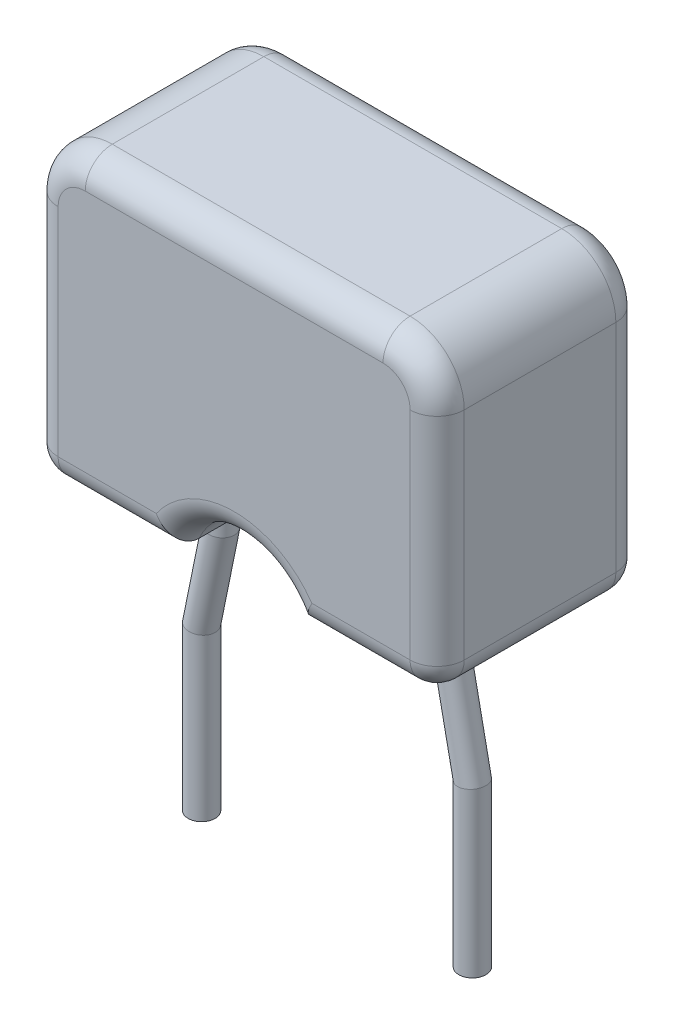
ISO-10303-21;
HEADER;
FILE_DESCRIPTION(('STEP AP214'),'2;1');
FILE_NAME('part.step','',(''),(''),'','','');
FILE_SCHEMA(('AUTOMOTIVE_DESIGN { 1 0 10303 214 1 1 1 1 }'));
ENDSEC;
DATA;
#1=APPLICATION_CONTEXT('core data for automotive mechanical design processes');
#2=APPLICATION_PROTOCOL_DEFINITION('international standard','automotive_design',2000,#1);
#3=PRODUCT_CONTEXT('',#1,'mechanical');
#4=PRODUCT('Part','Part','',(#3));
#5=PRODUCT_RELATED_PRODUCT_CATEGORY('part','',(#4));
#6=PRODUCT_DEFINITION_FORMATION('','',#4);
#7=PRODUCT_DEFINITION_CONTEXT('part definition',#1,'design');
#8=PRODUCT_DEFINITION('design','',#6,#7);
#9=PRODUCT_DEFINITION_SHAPE('','',#8);
#10=(LENGTH_UNIT() NAMED_UNIT(*) SI_UNIT(.MILLI.,.METRE.));
#11=(NAMED_UNIT(*) PLANE_ANGLE_UNIT() SI_UNIT($,.RADIAN.));
#12=(NAMED_UNIT(*) SI_UNIT($,.STERADIAN.) SOLID_ANGLE_UNIT());
#13=UNCERTAINTY_MEASURE_WITH_UNIT(LENGTH_MEASURE(1.E-05),#10,'distance_accuracy_value','');
#14=(GEOMETRIC_REPRESENTATION_CONTEXT(3) GLOBAL_UNCERTAINTY_ASSIGNED_CONTEXT((#13)) GLOBAL_UNIT_ASSIGNED_CONTEXT((#10,
#11,#12)) REPRESENTATION_CONTEXT('',''));
#15=CARTESIAN_POINT('',(0.,0.,0.));
#16=DIRECTION('',(0.,0.,1.));
#17=DIRECTION('',(1.,0.,0.));
#18=AXIS2_PLACEMENT_3D('',#15,#16,#17);
#19=CARTESIAN_POINT('',(-3.75,-2.75,3.8));
#20=DIRECTION('',(0.,1.,0.));
#21=DIRECTION('',(0.,0.,1.));
#22=AXIS2_PLACEMENT_3D('',#19,#20,#21);
#23=PLANE('',#22);
#24=CARTESIAN_POINT('',(-2.14564392373896,-2.75,1.9));
#25=DIRECTION('',(0.,1.,0.));
#26=DIRECTION('',(0.,0.,1.));
#27=AXIS2_PLACEMENT_3D('',#24,#25,#26);
#28=CIRCLE('',#27,0.25);
#29=CARTESIAN_POINT('',(-2.14564392373896,-2.75,2.15));
#30=VERTEX_POINT('',#29);
#31=EDGE_CURVE('E71',#30,#30,#28,.F.);
#32=ORIENTED_EDGE('',*,*,#31,.F.);
#33=EDGE_LOOP('',(#32));
#34=FACE_BOUND('',#33,.T.);
#35=DIRECTION('',(0.,0.,-1.));
#36=VECTOR('',#35,1.);
#37=CARTESIAN_POINT('',(-3.25,-2.75,3.8));
#38=LINE('',#37,#36);
#39=CARTESIAN_POINT('',(-3.25,-2.75,3.3));
#40=VERTEX_POINT('',#39);
#41=CARTESIAN_POINT('',(-3.25,-2.75,0.5));
#42=VERTEX_POINT('',#41);
#43=EDGE_CURVE('E442',#40,#42,#38,.T.);
#44=ORIENTED_EDGE('',*,*,#43,.T.);
#45=DIRECTION('',(1.,0.,0.));
#46=VECTOR('',#45,1.);
#47=CARTESIAN_POINT('',(-1.14564392373896,-2.75,0.5));
#48=LINE('',#47,#46);
#49=CARTESIAN_POINT('',(-1.14564392373896,-2.75,0.5));
#50=VERTEX_POINT('',#49);
#51=EDGE_CURVE('E241',#42,#50,#48,.T.);
#52=ORIENTED_EDGE('',*,*,#51,.T.);
#53=DIRECTION('',(0.,0.,1.));
#54=VECTOR('',#53,1.);
#55=CARTESIAN_POINT('',(-1.14564392373896,-2.75,0.));
#56=LINE('',#55,#54);
#57=CARTESIAN_POINT('',(-1.14564392373896,-2.75,3.3));
#58=VERTEX_POINT('',#57);
#59=EDGE_CURVE('E420',#50,#58,#56,.T.);
#60=ORIENTED_EDGE('',*,*,#59,.T.);
#61=DIRECTION('',(1.,0.,0.));
#62=VECTOR('',#61,1.);
#63=CARTESIAN_POINT('',(-3.75,-2.75,3.3));
#64=LINE('',#63,#62);
#65=EDGE_CURVE('E239',#58,#40,#64,.F.);
#66=ORIENTED_EDGE('',*,*,#65,.T.);
#67=EDGE_LOOP('',(#44,#52,#60,#66));
#68=FACE_BOUND('',#67,.T.);
#69=ADVANCED_FACE('F63',(#34,#68),#23,.F.);
#70=CARTESIAN_POINT('',(3.75,-2.75,3.8));
#71=DIRECTION('',(-1.,0.,0.));
#72=DIRECTION('',(0.,0.,1.));
#73=AXIS2_PLACEMENT_3D('',#70,#71,#72);
#74=PLANE('',#73);
#75=DIRECTION('',(0.,0.,-1.));
#76=VECTOR('',#75,1.);
#77=CARTESIAN_POINT('',(3.75,-2.25,3.8));
#78=LINE('',#77,#76);
#79=CARTESIAN_POINT('',(3.75,-2.25,3.3));
#80=VERTEX_POINT('',#79);
#81=CARTESIAN_POINT('',(3.75,-2.25,0.5));
#82=VERTEX_POINT('',#81);
#83=EDGE_CURVE('E434',#80,#82,#78,.T.);
#84=ORIENTED_EDGE('',*,*,#83,.T.);
#85=DIRECTION('',(0.,1.,0.));
#86=VECTOR('',#85,1.);
#87=CARTESIAN_POINT('',(3.75,1.75,0.5));
#88=LINE('',#87,#86);
#89=CARTESIAN_POINT('',(3.75,1.75,0.5));
#90=VERTEX_POINT('',#89);
#91=EDGE_CURVE('E258',#82,#90,#88,.T.);
#92=ORIENTED_EDGE('',*,*,#91,.T.);
#93=DIRECTION('',(0.,0.,-1.));
#94=VECTOR('',#93,1.);
#95=CARTESIAN_POINT('',(3.75,1.75,3.8));
#96=LINE('',#95,#94);
#97=CARTESIAN_POINT('',(3.75,1.75,3.3));
#98=VERTEX_POINT('',#97);
#99=EDGE_CURVE('E445',#90,#98,#96,.F.);
#100=ORIENTED_EDGE('',*,*,#99,.T.);
#101=DIRECTION('',(0.,1.,0.));
#102=VECTOR('',#101,1.);
#103=CARTESIAN_POINT('',(3.75,-2.75,3.3));
#104=LINE('',#103,#102);
#105=EDGE_CURVE('E256',#98,#80,#104,.F.);
#106=ORIENTED_EDGE('',*,*,#105,.T.);
#107=EDGE_LOOP('',(#84,#92,#100,#106));
#108=FACE_BOUND('',#107,.T.);
#109=ADVANCED_FACE('F384',(#108),#74,.F.);
#110=CARTESIAN_POINT('',(-3.75,2.75,3.8));
#111=DIRECTION('',(0.,-1.,0.));
#112=DIRECTION('',(0.,0.,-1.));
#113=AXIS2_PLACEMENT_3D('',#110,#111,#112);
#114=PLANE('',#113);
#115=DIRECTION('',(0.,0.,-1.));
#116=VECTOR('',#115,1.);
#117=CARTESIAN_POINT('',(2.75,2.75,3.8));
#118=LINE('',#117,#116);
#119=CARTESIAN_POINT('',(2.75,2.75,3.3));
#120=VERTEX_POINT('',#119);
#121=CARTESIAN_POINT('',(2.75,2.75,0.5));
#122=VERTEX_POINT('',#121);
#123=EDGE_CURVE('E475',#120,#122,#118,.T.);
#124=ORIENTED_EDGE('',*,*,#123,.T.);
#125=DIRECTION('',(-1.,0.,0.));
#126=VECTOR('',#125,1.);
#127=CARTESIAN_POINT('',(-2.75,2.75,0.5));
#128=LINE('',#127,#126);
#129=CARTESIAN_POINT('',(-2.75,2.75,0.5));
#130=VERTEX_POINT('',#129);
#131=EDGE_CURVE('E225',#122,#130,#128,.T.);
#132=ORIENTED_EDGE('',*,*,#131,.T.);
#133=DIRECTION('',(0.,0.,-1.));
#134=VECTOR('',#133,1.);
#135=CARTESIAN_POINT('',(-2.75,2.75,3.8));
#136=LINE('',#135,#134);
#137=CARTESIAN_POINT('',(-2.75,2.75,3.3));
#138=VERTEX_POINT('',#137);
#139=EDGE_CURVE('E478',#130,#138,#136,.F.);
#140=ORIENTED_EDGE('',*,*,#139,.T.);
#141=DIRECTION('',(-1.,0.,0.));
#142=VECTOR('',#141,1.);
#143=CARTESIAN_POINT('',(-3.75,2.75,3.3));
#144=LINE('',#143,#142);
#145=EDGE_CURVE('E223',#138,#120,#144,.F.);
#146=ORIENTED_EDGE('',*,*,#145,.T.);
#147=EDGE_LOOP('',(#124,#132,#140,#146));
#148=FACE_BOUND('',#147,.T.);
#149=ADVANCED_FACE('F391',(#148),#114,.F.);
#150=CARTESIAN_POINT('',(-3.75,-2.75,3.8));
#151=DIRECTION('',(1.,0.,0.));
#152=DIRECTION('',(0.,0.,-1.));
#153=AXIS2_PLACEMENT_3D('',#150,#151,#152);
#154=PLANE('',#153);
#155=DIRECTION('',(0.,0.,-1.));
#156=VECTOR('',#155,1.);
#157=CARTESIAN_POINT('',(-3.75,1.75,3.8));
#158=LINE('',#157,#156);
#159=CARTESIAN_POINT('',(-3.75,1.75,3.3));
#160=VERTEX_POINT('',#159);
#161=CARTESIAN_POINT('',(-3.75,1.75,0.5));
#162=VERTEX_POINT('',#161);
#163=EDGE_CURVE('E440',#160,#162,#158,.T.);
#164=ORIENTED_EDGE('',*,*,#163,.T.);
#165=DIRECTION('',(0.,-1.,0.));
#166=VECTOR('',#165,1.);
#167=CARTESIAN_POINT('',(-3.75,-2.25,0.5));
#168=LINE('',#167,#166);
#169=CARTESIAN_POINT('',(-3.75,-2.25,0.5));
#170=VERTEX_POINT('',#169);
#171=EDGE_CURVE('E233',#162,#170,#168,.T.);
#172=ORIENTED_EDGE('',*,*,#171,.T.);
#173=DIRECTION('',(0.,0.,-1.));
#174=VECTOR('',#173,1.);
#175=CARTESIAN_POINT('',(-3.75,-2.25,3.8));
#176=LINE('',#175,#174);
#177=CARTESIAN_POINT('',(-3.75,-2.25,3.3));
#178=VERTEX_POINT('',#177);
#179=EDGE_CURVE('E209',#170,#178,#176,.F.);
#180=ORIENTED_EDGE('',*,*,#179,.T.);
#181=DIRECTION('',(0.,-1.,0.));
#182=VECTOR('',#181,1.);
#183=CARTESIAN_POINT('',(-3.75,-2.75,3.3));
#184=LINE('',#183,#182);
#185=EDGE_CURVE('E231',#178,#160,#184,.F.);
#186=ORIENTED_EDGE('',*,*,#185,.T.);
#187=EDGE_LOOP('',(#164,#172,#180,#186));
#188=FACE_BOUND('',#187,.T.);
#189=ADVANCED_FACE('F400',(#188),#154,.F.);
#190=CARTESIAN_POINT('',(2.14564392373896,-2.75,1.9));
#191=DIRECTION('',(0.,1.,0.));
#192=DIRECTION('',(0.,0.,1.));
#193=AXIS2_PLACEMENT_3D('',#190,#191,#192);
#194=CIRCLE('',#193,0.25);
#195=CARTESIAN_POINT('',(2.14564392373896,-2.75,2.15));
#196=VERTEX_POINT('',#195);
#197=EDGE_CURVE('E12',#196,#196,#194,.F.);
#198=ORIENTED_EDGE('',*,*,#197,.F.);
#199=EDGE_LOOP('',(#198));
#200=FACE_BOUND('',#199,.T.);
#201=DIRECTION('',(0.,0.,1.));
#202=VECTOR('',#201,1.);
#203=CARTESIAN_POINT('',(1.14564392373896,-2.75,0.));
#204=LINE('',#203,#202);
#205=CARTESIAN_POINT('',(1.14564392373896,-2.75,3.3));
#206=VERTEX_POINT('',#205);
#207=CARTESIAN_POINT('',(1.14564392373896,-2.75,0.5));
#208=VERTEX_POINT('',#207);
#209=EDGE_CURVE('E412',#206,#208,#204,.F.);
#210=ORIENTED_EDGE('',*,*,#209,.T.);
#211=DIRECTION('',(1.,0.,0.));
#212=VECTOR('',#211,1.);
#213=CARTESIAN_POINT('',(3.25,-2.75,0.5));
#214=LINE('',#213,#212);
#215=CARTESIAN_POINT('',(3.25,-2.75,0.5));
#216=VERTEX_POINT('',#215);
#217=EDGE_CURVE('E250',#208,#216,#214,.T.);
#218=ORIENTED_EDGE('',*,*,#217,.T.);
#219=DIRECTION('',(0.,0.,-1.));
#220=VECTOR('',#219,1.);
#221=CARTESIAN_POINT('',(3.25,-2.75,3.8));
#222=LINE('',#221,#220);
#223=CARTESIAN_POINT('',(3.25,-2.75,3.3));
#224=VERTEX_POINT('',#223);
#225=EDGE_CURVE('E436',#216,#224,#222,.F.);
#226=ORIENTED_EDGE('',*,*,#225,.T.);
#227=DIRECTION('',(1.,0.,0.));
#228=VECTOR('',#227,1.);
#229=CARTESIAN_POINT('',(-3.75,-2.75,3.3));
#230=LINE('',#229,#228);
#231=EDGE_CURVE('E248',#224,#206,#230,.F.);
#232=ORIENTED_EDGE('',*,*,#231,.T.);
#233=EDGE_LOOP('',(#210,#218,#226,#232));
#234=FACE_BOUND('',#233,.T.);
#235=ADVANCED_FACE('F387',(#200,#234),#23,.F.);
#236=CARTESIAN_POINT('',(0.,0.,3.8));
#237=DIRECTION('',(0.,0.,-1.));
#238=DIRECTION('',(-1.,0.,0.));
#239=AXIS2_PLACEMENT_3D('',#236,#237,#238);
#240=PLANE('',#239);
#241=DIRECTION('',(1.,0.,0.));
#242=VECTOR('',#241,1.);
#243=CARTESIAN_POINT('',(0.,-2.25,3.8));
#244=LINE('',#243,#242);
#245=CARTESIAN_POINT('',(-3.25,-2.25,3.8));
#246=VERTEX_POINT('',#245);
#247=CARTESIAN_POINT('',(-1.43614066163451,-2.25,3.8));
#248=VERTEX_POINT('',#247);
#249=EDGE_CURVE('E78',#246,#248,#244,.T.);
#250=ORIENTED_EDGE('',*,*,#249,.T.);
#251=CARTESIAN_POINT('',(0.,-3.25,3.8));
#252=DIRECTION('',(0.,0.,-1.));
#253=DIRECTION('',(-1.,0.,0.));
#254=AXIS2_PLACEMENT_3D('',#251,#252,#253);
#255=CIRCLE('',#254,1.75);
#256=CARTESIAN_POINT('',(1.43614066163451,-2.25,3.8));
#257=VERTEX_POINT('',#256);
#258=EDGE_CURVE('E272',#248,#257,#255,.T.);
#259=ORIENTED_EDGE('',*,*,#258,.T.);
#260=DIRECTION('',(1.,0.,0.));
#261=VECTOR('',#260,1.);
#262=CARTESIAN_POINT('',(0.,-2.25,3.8));
#263=LINE('',#262,#261);
#264=CARTESIAN_POINT('',(3.25,-2.25,3.8));
#265=VERTEX_POINT('',#264);
#266=EDGE_CURVE('E260',#257,#265,#263,.T.);
#267=ORIENTED_EDGE('',*,*,#266,.T.);
#268=DIRECTION('',(0.,1.,0.));
#269=VECTOR('',#268,1.);
#270=CARTESIAN_POINT('',(3.25,0.,3.8));
#271=LINE('',#270,#269);
#272=CARTESIAN_POINT('',(3.25,1.75,3.8));
#273=VERTEX_POINT('',#272);
#274=EDGE_CURVE('E262',#265,#273,#271,.T.);
#275=ORIENTED_EDGE('',*,*,#274,.T.);
#276=CARTESIAN_POINT('',(2.75,1.75,3.8));
#277=DIRECTION('',(0.,0.,-1.));
#278=DIRECTION('',(-1.,0.,0.));
#279=AXIS2_PLACEMENT_3D('',#276,#277,#278);
#280=CIRCLE('',#279,0.5);
#281=CARTESIAN_POINT('',(2.75,2.25,3.8));
#282=VERTEX_POINT('',#281);
#283=EDGE_CURVE('E264',#273,#282,#280,.F.);
#284=ORIENTED_EDGE('',*,*,#283,.T.);
#285=DIRECTION('',(-1.,0.,0.));
#286=VECTOR('',#285,1.);
#287=CARTESIAN_POINT('',(0.,2.25,3.8));
#288=LINE('',#287,#286);
#289=CARTESIAN_POINT('',(-2.75,2.25,3.8));
#290=VERTEX_POINT('',#289);
#291=EDGE_CURVE('E266',#282,#290,#288,.T.);
#292=ORIENTED_EDGE('',*,*,#291,.T.);
#293=CARTESIAN_POINT('',(-2.75,1.75,3.8));
#294=DIRECTION('',(0.,0.,-1.));
#295=DIRECTION('',(-1.,0.,0.));
#296=AXIS2_PLACEMENT_3D('',#293,#294,#295);
#297=CIRCLE('',#296,0.5);
#298=CARTESIAN_POINT('',(-3.25,1.75,3.8));
#299=VERTEX_POINT('',#298);
#300=EDGE_CURVE('E268',#290,#299,#297,.F.);
#301=ORIENTED_EDGE('',*,*,#300,.T.);
#302=DIRECTION('',(0.,-1.,0.));
#303=VECTOR('',#302,1.);
#304=CARTESIAN_POINT('',(-3.25,0.,3.8));
#305=LINE('',#304,#303);
#306=EDGE_CURVE('E83',#299,#246,#305,.T.);
#307=ORIENTED_EDGE('',*,*,#306,.T.);
#308=EDGE_LOOP('',(#250,#259,#267,#275,#284,#292,#301,#307));
#309=FACE_BOUND('',#308,.T.);
#310=ADVANCED_FACE('F399',(#309),#240,.F.);
#311=CARTESIAN_POINT('',(0.,0.,0.));
#312=DIRECTION('',(0.,0.,-1.));
#313=DIRECTION('',(-1.,0.,0.));
#314=AXIS2_PLACEMENT_3D('',#311,#312,#313);
#315=PLANE('',#314);
#316=DIRECTION('',(-1.,0.,0.));
#317=VECTOR('',#316,1.);
#318=CARTESIAN_POINT('',(2.75,2.25,0.));
#319=LINE('',#318,#317);
#320=CARTESIAN_POINT('',(-2.75,2.25,0.));
#321=VERTEX_POINT('',#320);
#322=CARTESIAN_POINT('',(2.75,2.25,0.));
#323=VERTEX_POINT('',#322);
#324=EDGE_CURVE('E213',#321,#323,#319,.F.);
#325=ORIENTED_EDGE('',*,*,#324,.T.);
#326=CARTESIAN_POINT('',(2.75,1.75,0.));
#327=DIRECTION('',(0.,0.,-1.));
#328=DIRECTION('',(-1.,0.,0.));
#329=AXIS2_PLACEMENT_3D('',#326,#327,#328);
#330=CIRCLE('',#329,0.5);
#331=CARTESIAN_POINT('',(3.25,1.75,0.));
#332=VERTEX_POINT('',#331);
#333=EDGE_CURVE('E193',#323,#332,#330,.T.);
#334=ORIENTED_EDGE('',*,*,#333,.T.);
#335=DIRECTION('',(0.,1.,0.));
#336=VECTOR('',#335,1.);
#337=CARTESIAN_POINT('',(3.25,-2.25,0.));
#338=LINE('',#337,#336);
#339=CARTESIAN_POINT('',(3.25,-2.25,0.));
#340=VERTEX_POINT('',#339);
#341=EDGE_CURVE('E202',#332,#340,#338,.F.);
#342=ORIENTED_EDGE('',*,*,#341,.T.);
#343=DIRECTION('',(1.,0.,0.));
#344=VECTOR('',#343,1.);
#345=CARTESIAN_POINT('',(1.14564392373896,-2.25,0.));
#346=LINE('',#345,#344);
#347=CARTESIAN_POINT('',(1.43614066163451,-2.25,0.));
#348=VERTEX_POINT('',#347);
#349=EDGE_CURVE('E208',#340,#348,#346,.F.);
#350=ORIENTED_EDGE('',*,*,#349,.T.);
#351=CARTESIAN_POINT('',(0.,-3.25,0.));
#352=DIRECTION('',(0.,0.,-1.));
#353=DIRECTION('',(-1.,0.,0.));
#354=AXIS2_PLACEMENT_3D('',#351,#352,#353);
#355=CIRCLE('',#354,1.75);
#356=CARTESIAN_POINT('',(-1.43614066163451,-2.25,0.));
#357=VERTEX_POINT('',#356);
#358=EDGE_CURVE('E424',#348,#357,#355,.F.);
#359=ORIENTED_EDGE('',*,*,#358,.T.);
#360=DIRECTION('',(1.,0.,0.));
#361=VECTOR('',#360,1.);
#362=CARTESIAN_POINT('',(-3.25,-2.25,0.));
#363=LINE('',#362,#361);
#364=CARTESIAN_POINT('',(-3.25,-2.25,0.));
#365=VERTEX_POINT('',#364);
#366=EDGE_CURVE('E455',#357,#365,#363,.F.);
#367=ORIENTED_EDGE('',*,*,#366,.T.);
#368=DIRECTION('',(0.,-1.,0.));
#369=VECTOR('',#368,1.);
#370=CARTESIAN_POINT('',(-3.25,1.75,0.));
#371=LINE('',#370,#369);
#372=CARTESIAN_POINT('',(-3.25,1.75,0.));
#373=VERTEX_POINT('',#372);
#374=EDGE_CURVE('E457',#365,#373,#371,.F.);
#375=ORIENTED_EDGE('',*,*,#374,.T.);
#376=CARTESIAN_POINT('',(-2.75,1.75,0.));
#377=DIRECTION('',(0.,0.,-1.));
#378=DIRECTION('',(-1.,0.,0.));
#379=AXIS2_PLACEMENT_3D('',#376,#377,#378);
#380=CIRCLE('',#379,0.5);
#381=EDGE_CURVE('E218',#373,#321,#380,.T.);
#382=ORIENTED_EDGE('',*,*,#381,.T.);
#383=EDGE_LOOP('',(#325,#334,#342,#350,#359,#367,#375,#382));
#384=FACE_BOUND('',#383,.T.);
#385=ADVANCED_FACE('F211',(#384),#315,.T.);
#386=CARTESIAN_POINT('',(0.,-3.25,0.));
#387=DIRECTION('',(0.,0.,1.));
#388=DIRECTION('',(1.,0.,0.));
#389=AXIS2_PLACEMENT_3D('',#386,#387,#388);
#390=CYLINDRICAL_SURFACE('',#389,1.25);
#391=ORIENTED_EDGE('',*,*,#59,.F.);
#392=CARTESIAN_POINT('',(0.,-3.25,0.5));
#393=DIRECTION('',(0.,0.,-1.));
#394=DIRECTION('',(-1.,0.,0.));
#395=AXIS2_PLACEMENT_3D('',#392,#393,#394);
#396=CIRCLE('',#395,1.25);
#397=EDGE_CURVE('E246',#50,#208,#396,.T.);
#398=ORIENTED_EDGE('',*,*,#397,.T.);
#399=ORIENTED_EDGE('',*,*,#209,.F.);
#400=CARTESIAN_POINT('',(0.,-3.25,3.3));
#401=DIRECTION('',(0.,0.,-1.));
#402=DIRECTION('',(-1.,0.,0.));
#403=AXIS2_PLACEMENT_3D('',#400,#401,#402);
#404=CIRCLE('',#403,1.25);
#405=EDGE_CURVE('E243',#206,#58,#404,.F.);
#406=ORIENTED_EDGE('',*,*,#405,.T.);
#407=EDGE_LOOP('',(#391,#398,#399,#406));
#408=FACE_BOUND('',#407,.T.);
#409=ADVANCED_FACE('F528',(#408),#390,.F.);
#410=CARTESIAN_POINT('',(2.75,1.75,3.8));
#411=DIRECTION('',(0.,0.,-1.));
#412=DIRECTION('',(-1.,0.,0.));
#413=AXIS2_PLACEMENT_3D('',#410,#411,#412);
#414=CYLINDRICAL_SURFACE('',#413,1.);
#415=ORIENTED_EDGE('',*,*,#99,.F.);
#416=CARTESIAN_POINT('',(2.75,1.75,0.5));
#417=DIRECTION('',(0.,0.,-1.));
#418=DIRECTION('',(-1.,0.,0.));
#419=AXIS2_PLACEMENT_3D('',#416,#417,#418);
#420=CIRCLE('',#419,1.);
#421=EDGE_CURVE('E195',#90,#122,#420,.F.);
#422=ORIENTED_EDGE('',*,*,#421,.T.);
#423=ORIENTED_EDGE('',*,*,#123,.F.);
#424=CARTESIAN_POINT('',(2.75,1.75,3.3));
#425=DIRECTION('',(0.,0.,-1.));
#426=DIRECTION('',(-1.,0.,0.));
#427=AXIS2_PLACEMENT_3D('',#424,#425,#426);
#428=CIRCLE('',#427,1.);
#429=EDGE_CURVE('E215',#120,#98,#428,.T.);
#430=ORIENTED_EDGE('',*,*,#429,.T.);
#431=EDGE_LOOP('',(#415,#422,#423,#430));
#432=FACE_BOUND('',#431,.T.);
#433=ADVANCED_FACE('F474',(#432),#414,.T.);
#434=CARTESIAN_POINT('',(-2.75,1.75,3.8));
#435=DIRECTION('',(0.,0.,-1.));
#436=DIRECTION('',(-1.,0.,0.));
#437=AXIS2_PLACEMENT_3D('',#434,#435,#436);
#438=CYLINDRICAL_SURFACE('',#437,1.);
#439=ORIENTED_EDGE('',*,*,#139,.F.);
#440=CARTESIAN_POINT('',(-2.75,1.75,0.5));
#441=DIRECTION('',(0.,0.,-1.));
#442=DIRECTION('',(-1.,0.,0.));
#443=AXIS2_PLACEMENT_3D('',#440,#441,#442);
#444=CIRCLE('',#443,1.);
#445=EDGE_CURVE('E229',#130,#162,#444,.F.);
#446=ORIENTED_EDGE('',*,*,#445,.T.);
#447=ORIENTED_EDGE('',*,*,#163,.F.);
#448=CARTESIAN_POINT('',(-2.75,1.75,3.3));
#449=DIRECTION('',(0.,0.,-1.));
#450=DIRECTION('',(-1.,0.,0.));
#451=AXIS2_PLACEMENT_3D('',#448,#449,#450);
#452=CIRCLE('',#451,1.);
#453=EDGE_CURVE('E227',#160,#138,#452,.T.);
#454=ORIENTED_EDGE('',*,*,#453,.T.);
#455=EDGE_LOOP('',(#439,#446,#447,#454));
#456=FACE_BOUND('',#455,.T.);
#457=ADVANCED_FACE('F545',(#456),#438,.T.);
#458=CARTESIAN_POINT('',(3.25,-2.25,3.8));
#459=DIRECTION('',(0.,0.,-1.));
#460=DIRECTION('',(-1.,0.,0.));
#461=AXIS2_PLACEMENT_3D('',#458,#459,#460);
#462=CYLINDRICAL_SURFACE('',#461,0.5);
#463=ORIENTED_EDGE('',*,*,#225,.F.);
#464=CARTESIAN_POINT('',(3.25,-2.25,0.5));
#465=DIRECTION('',(0.,0.,-1.));
#466=DIRECTION('',(-1.,0.,0.));
#467=AXIS2_PLACEMENT_3D('',#464,#465,#466);
#468=CIRCLE('',#467,0.5);
#469=EDGE_CURVE('E254',#216,#82,#468,.F.);
#470=ORIENTED_EDGE('',*,*,#469,.T.);
#471=ORIENTED_EDGE('',*,*,#83,.F.);
#472=CARTESIAN_POINT('',(3.25,-2.25,3.3));
#473=DIRECTION('',(0.,0.,-1.));
#474=DIRECTION('',(-1.,0.,0.));
#475=AXIS2_PLACEMENT_3D('',#472,#473,#474);
#476=CIRCLE('',#475,0.5);
#477=EDGE_CURVE('E252',#80,#224,#476,.T.);
#478=ORIENTED_EDGE('',*,*,#477,.T.);
#479=EDGE_LOOP('',(#463,#470,#471,#478));
#480=FACE_BOUND('',#479,.T.);
#481=ADVANCED_FACE('F433',(#480),#462,.T.);
#482=CARTESIAN_POINT('',(-3.25,-2.25,3.8));
#483=DIRECTION('',(0.,0.,-1.));
#484=DIRECTION('',(-1.,0.,0.));
#485=AXIS2_PLACEMENT_3D('',#482,#483,#484);
#486=CYLINDRICAL_SURFACE('',#485,0.5);
#487=ORIENTED_EDGE('',*,*,#179,.F.);
#488=CARTESIAN_POINT('',(-3.25,-2.25,0.5));
#489=DIRECTION('',(0.,0.,-1.));
#490=DIRECTION('',(-1.,0.,0.));
#491=AXIS2_PLACEMENT_3D('',#488,#489,#490);
#492=CIRCLE('',#491,0.5);
#493=EDGE_CURVE('E237',#170,#42,#492,.F.);
#494=ORIENTED_EDGE('',*,*,#493,.T.);
#495=ORIENTED_EDGE('',*,*,#43,.F.);
#496=CARTESIAN_POINT('',(-3.25,-2.25,3.3));
#497=DIRECTION('',(0.,0.,-1.));
#498=DIRECTION('',(-1.,0.,0.));
#499=AXIS2_PLACEMENT_3D('',#496,#497,#498);
#500=CIRCLE('',#499,0.5);
#501=EDGE_CURVE('E235',#40,#178,#500,.T.);
#502=ORIENTED_EDGE('',*,*,#501,.T.);
#503=EDGE_LOOP('',(#487,#494,#495,#502));
#504=FACE_BOUND('',#503,.T.);
#505=ADVANCED_FACE('F321',(#504),#486,.T.);
#506=CARTESIAN_POINT('',(-3.75,-2.25,0.5));
#507=DIRECTION('',(-1.,0.,0.));
#508=DIRECTION('',(0.,0.,1.));
#509=AXIS2_PLACEMENT_3D('',#506,#507,#508);
#510=CYLINDRICAL_SURFACE('',#509,0.5);
#511=CARTESIAN_POINT('',(-1.14564392373896,-2.75,0.5));
#512=CARTESIAN_POINT('',(-1.1456146359931,-2.75003415709231,0.474929334473534));
#513=CARTESIAN_POINT('',(-1.14687682330495,-2.74811696321521,0.449898019227566));
#514=CARTESIAN_POINT('',(-1.15174187825817,-2.74066704356725,0.400749004404432));
#515=CARTESIAN_POINT('',(-1.15533182598775,-2.73515427355561,0.376627034973077));
#516=CARTESIAN_POINT('',(-1.16460798670412,-2.72080548310635,0.329875204686569));
#517=CARTESIAN_POINT('',(-1.17029107042402,-2.71197442316128,0.307243175584258));
#518=CARTESIAN_POINT('',(-1.18341039109392,-2.69138872202612,0.263880351840278));
#519=CARTESIAN_POINT('',(-1.19084879186248,-2.67963047143169,0.243151948005364));
#520=CARTESIAN_POINT('',(-1.20768989374385,-2.65270701111219,0.202576417153044));
#521=CARTESIAN_POINT('',(-1.21719340181637,-2.63736139864625,0.18289154431559));
#522=CARTESIAN_POINT('',(-1.23739499880522,-2.60430386268454,0.146338271128829));
#523=CARTESIAN_POINT('',(-1.24809336559409,-2.58659138857006,0.129470528207656));
#524=CARTESIAN_POINT('',(-1.27204457641314,-2.54637778986672,0.09634367226935));
#525=CARTESIAN_POINT('',(-1.28543789225902,-2.52355856743156,0.0805719352400186));
#526=CARTESIAN_POINT('',(-1.312925504268,-2.47594398607556,0.0531156497158104));
#527=CARTESIAN_POINT('',(-1.32702052709396,-2.45114656189465,0.0414354432290436));
#528=CARTESIAN_POINT('',(-1.35660565503913,-2.39823732239151,0.0215826353260559));
#529=CARTESIAN_POINT('',(-1.37212106432067,-2.37001643725394,0.0137391160013261));
#530=CARTESIAN_POINT('',(-1.40311135663167,-2.31267856655792,0.00309124109019123));
#531=CARTESIAN_POINT('',(-1.41858624759414,-2.28356389301502,0.000274842400073444));
#532=CARTESIAN_POINT('',(-1.43461673913581,-2.25291693979513,6.36804739415933E-06));
#533=CARTESIAN_POINT('',(-1.43537897170078,-2.25145853700219,-1.52183481302594E-08));
#534=CARTESIAN_POINT('',(-1.43614066163451,-2.25,0.));
#535=B_SPLINE_CURVE_WITH_KNOTS('',3,(#511,#512,#513,#514,#515,#516,#517,#518,#519,#520,#521,
#522,#523,#524,#525,#526,#527,#528,#529,#530,#531,#532,#533,#534),.UNSPECIFIED.,.F.,.F.,(4,2,2,
2,2,2,2,2,2,2,2,4),(0.,0.075045049507425,0.149677096622654,0.224198017733067,0.298811286801887,
0.378627647518532,0.458462608875667,0.550503996168851,0.642642765669475,0.741697382406837,
0.840514381161582,0.845451104859349),.UNSPECIFIED.);
#536=EDGE_CURVE('E308',#50,#357,#535,.T.);
#537=ORIENTED_EDGE('',*,*,#536,.F.);
#538=ORIENTED_EDGE('',*,*,#51,.F.);
#539=CARTESIAN_POINT('',(-3.25,-2.25,0.5));
#540=DIRECTION('',(-1.,0.,0.));
#541=DIRECTION('',(0.,0.,1.));
#542=AXIS2_PLACEMENT_3D('',#539,#540,#541);
#543=CIRCLE('',#542,0.5);
#544=EDGE_CURVE('E315',#365,#42,#543,.T.);
#545=ORIENTED_EDGE('',*,*,#544,.F.);
#546=ORIENTED_EDGE('',*,*,#366,.F.);
#547=EDGE_LOOP('',(#537,#538,#545,#546));
#548=FACE_BOUND('',#547,.T.);
#549=ADVANCED_FACE('F317',(#548),#510,.T.);
#550=CARTESIAN_POINT('',(-3.25,-2.25,0.5));
#551=DIRECTION('',(0.,0.,-1.));
#552=DIRECTION('',(-1.,0.,0.));
#553=AXIS2_PLACEMENT_3D('',#550,#551,#552);
#554=SPHERICAL_SURFACE('',#553,0.5);
#555=ORIENTED_EDGE('',*,*,#544,.T.);
#556=ORIENTED_EDGE('',*,*,#493,.F.);
#557=CARTESIAN_POINT('',(-3.25,-2.25,0.5));
#558=DIRECTION('',(0.,1.,0.));
#559=DIRECTION('',(0.,0.,1.));
#560=AXIS2_PLACEMENT_3D('',#557,#558,#559);
#561=CIRCLE('',#560,0.5);
#562=EDGE_CURVE('E294',#365,#170,#561,.T.);
#563=ORIENTED_EDGE('',*,*,#562,.F.);
#564=EDGE_LOOP('',(#555,#556,#563));
#565=FACE_BOUND('',#564,.T.);
#566=ADVANCED_FACE('F304',(#565),#554,.T.);
#567=CARTESIAN_POINT('',(0.,-3.25,0.5));
#568=DIRECTION('',(0.,0.,-1.));
#569=DIRECTION('',(-1.,0.,0.));
#570=AXIS2_PLACEMENT_3D('',#567,#568,#569);
#571=TOROIDAL_SURFACE('',#570,1.75,0.5);
#572=ORIENTED_EDGE('',*,*,#536,.T.);
#573=ORIENTED_EDGE('',*,*,#358,.F.);
#574=CARTESIAN_POINT('',(1.14564392373896,-2.75,0.5));
#575=CARTESIAN_POINT('',(1.1456146359931,-2.75003415709231,0.474929334473534));
#576=CARTESIAN_POINT('',(1.14687682330495,-2.74811696321521,0.449898019227566));
#577=CARTESIAN_POINT('',(1.15174187825817,-2.74066704356725,0.400749004404432));
#578=CARTESIAN_POINT('',(1.15533182598775,-2.73515427355561,0.376627034973077));
#579=CARTESIAN_POINT('',(1.16460798670412,-2.72080548310635,0.329875204686569));
#580=CARTESIAN_POINT('',(1.17029107042402,-2.71197442316128,0.307243175584258));
#581=CARTESIAN_POINT('',(1.18341039109392,-2.69138872202612,0.263880351840278));
#582=CARTESIAN_POINT('',(1.19084879186248,-2.67963047143169,0.243151948005364));
#583=CARTESIAN_POINT('',(1.20768989374385,-2.65270701111219,0.202576417153044));
#584=CARTESIAN_POINT('',(1.21719340181637,-2.63736139864625,0.18289154431559));
#585=CARTESIAN_POINT('',(1.23739499880522,-2.60430386268454,0.146338271128829));
#586=CARTESIAN_POINT('',(1.24809336559409,-2.58659138857006,0.129470528207656));
#587=CARTESIAN_POINT('',(1.27204457641314,-2.54637778986672,0.09634367226935));
#588=CARTESIAN_POINT('',(1.28543789225902,-2.52355856743156,0.0805719352400186));
#589=CARTESIAN_POINT('',(1.312925504268,-2.47594398607556,0.0531156497158104));
#590=CARTESIAN_POINT('',(1.32702052709396,-2.45114656189465,0.0414354432290436));
#591=CARTESIAN_POINT('',(1.35660565503913,-2.39823732239151,0.0215826353260559));
#592=CARTESIAN_POINT('',(1.37212106432067,-2.37001643725394,0.0137391160013261));
#593=CARTESIAN_POINT('',(1.40311135663167,-2.31267856655792,0.00309124109019123));
#594=CARTESIAN_POINT('',(1.41858624759414,-2.28356389301502,0.000274842400073444));
#595=CARTESIAN_POINT('',(1.43461673913581,-2.25291693979513,6.36804739415933E-06));
#596=CARTESIAN_POINT('',(1.43537897170078,-2.25145853700219,-1.52183481302594E-08));
#597=CARTESIAN_POINT('',(1.43614066163451,-2.25,0.));
#598=B_SPLINE_CURVE_WITH_KNOTS('',3,(#574,#575,#576,#577,#578,#579,#580,#581,#582,#583,#584,
#585,#586,#587,#588,#589,#590,#591,#592,#593,#594,#595,#596,#597),.UNSPECIFIED.,.F.,.F.,(4,2,2,
2,2,2,2,2,2,2,2,4),(0.,0.075045049507425,0.149677096622654,0.224198017733067,0.298811286801887,
0.378627647518532,0.458462608875667,0.550503996168851,0.642642765669475,0.741697382406837,
0.840514381161582,0.845451104859349),.UNSPECIFIED.);
#599=EDGE_CURVE('E285',#208,#348,#598,.T.);
#600=ORIENTED_EDGE('',*,*,#599,.F.);
#601=ORIENTED_EDGE('',*,*,#397,.F.);
#602=EDGE_LOOP('',(#572,#573,#600,#601));
#603=FACE_BOUND('',#602,.T.);
#604=ADVANCED_FACE('F299',(#603),#571,.T.);
#605=CARTESIAN_POINT('',(-3.25,-2.75,0.5));
#606=DIRECTION('',(0.,1.,0.));
#607=DIRECTION('',(0.,0.,1.));
#608=AXIS2_PLACEMENT_3D('',#605,#606,#607);
#609=CYLINDRICAL_SURFACE('',#608,0.5);
#610=ORIENTED_EDGE('',*,*,#562,.T.);
#611=ORIENTED_EDGE('',*,*,#171,.F.);
#612=CARTESIAN_POINT('',(-3.25,1.75,0.5));
#613=DIRECTION('',(0.,1.,0.));
#614=DIRECTION('',(0.,0.,1.));
#615=AXIS2_PLACEMENT_3D('',#612,#613,#614);
#616=CIRCLE('',#615,0.5);
#617=EDGE_CURVE('E282',#373,#162,#616,.T.);
#618=ORIENTED_EDGE('',*,*,#617,.F.);
#619=ORIENTED_EDGE('',*,*,#374,.F.);
#620=EDGE_LOOP('',(#610,#611,#618,#619));
#621=FACE_BOUND('',#620,.T.);
#622=ADVANCED_FACE('F303',(#621),#609,.T.);
#623=CARTESIAN_POINT('',(-3.75,-2.25,0.5));
#624=DIRECTION('',(-1.,0.,0.));
#625=DIRECTION('',(0.,0.,1.));
#626=AXIS2_PLACEMENT_3D('',#623,#624,#625);
#627=CYLINDRICAL_SURFACE('',#626,0.5);
#628=ORIENTED_EDGE('',*,*,#599,.T.);
#629=ORIENTED_EDGE('',*,*,#349,.F.);
#630=CARTESIAN_POINT('',(3.25,-2.25,0.5));
#631=DIRECTION('',(1.,0.,0.));
#632=DIRECTION('',(0.,0.,-1.));
#633=AXIS2_PLACEMENT_3D('',#630,#631,#632);
#634=CIRCLE('',#633,0.5);
#635=EDGE_CURVE('E279',#216,#340,#634,.T.);
#636=ORIENTED_EDGE('',*,*,#635,.F.);
#637=ORIENTED_EDGE('',*,*,#217,.F.);
#638=EDGE_LOOP('',(#628,#629,#636,#637));
#639=FACE_BOUND('',#638,.T.);
#640=ADVANCED_FACE('F296',(#639),#627,.T.);
#641=CARTESIAN_POINT('',(-2.75,1.75,0.5));
#642=DIRECTION('',(0.,0.,-1.));
#643=DIRECTION('',(-1.,0.,0.));
#644=AXIS2_PLACEMENT_3D('',#641,#642,#643);
#645=DEGENERATE_TOROIDAL_SURFACE('',#644,0.5,0.5,.T.);
#646=ORIENTED_EDGE('',*,*,#617,.T.);
#647=ORIENTED_EDGE('',*,*,#445,.F.);
#648=CARTESIAN_POINT('',(-2.75,2.25,0.5));
#649=DIRECTION('',(1.,0.,0.));
#650=DIRECTION('',(0.,0.,-1.));
#651=AXIS2_PLACEMENT_3D('',#648,#649,#650);
#652=CIRCLE('',#651,0.5);
#653=EDGE_CURVE('E276',#321,#130,#652,.T.);
#654=ORIENTED_EDGE('',*,*,#653,.F.);
#655=ORIENTED_EDGE('',*,*,#381,.F.);
#656=EDGE_LOOP('',(#646,#647,#654,#655));
#657=FACE_BOUND('',#656,.T.);
#658=ADVANCED_FACE('F464',(#657),#645,.T.);
#659=CARTESIAN_POINT('',(3.25,-2.25,0.5));
#660=DIRECTION('',(0.,0.,-1.));
#661=DIRECTION('',(-1.,0.,0.));
#662=AXIS2_PLACEMENT_3D('',#659,#660,#661);
#663=SPHERICAL_SURFACE('',#662,0.5);
#664=ORIENTED_EDGE('',*,*,#469,.F.);
#665=ORIENTED_EDGE('',*,*,#635,.T.);
#666=CARTESIAN_POINT('',(3.25,-2.25,0.5));
#667=DIRECTION('',(0.,1.,0.));
#668=DIRECTION('',(0.,0.,1.));
#669=AXIS2_PLACEMENT_3D('',#666,#667,#668);
#670=CIRCLE('',#669,0.5);
#671=EDGE_CURVE('E205',#82,#340,#670,.T.);
#672=ORIENTED_EDGE('',*,*,#671,.F.);
#673=EDGE_LOOP('',(#664,#665,#672));
#674=FACE_BOUND('',#673,.T.);
#675=ADVANCED_FACE('F429',(#674),#663,.T.);
#676=CARTESIAN_POINT('',(-3.75,2.25,0.5));
#677=DIRECTION('',(1.,0.,0.));
#678=DIRECTION('',(0.,0.,-1.));
#679=AXIS2_PLACEMENT_3D('',#676,#677,#678);
#680=CYLINDRICAL_SURFACE('',#679,0.5);
#681=ORIENTED_EDGE('',*,*,#653,.T.);
#682=ORIENTED_EDGE('',*,*,#131,.F.);
#683=CARTESIAN_POINT('',(2.75,2.25,0.5));
#684=DIRECTION('',(1.,0.,0.));
#685=DIRECTION('',(0.,0.,-1.));
#686=AXIS2_PLACEMENT_3D('',#683,#684,#685);
#687=CIRCLE('',#686,0.5);
#688=EDGE_CURVE('E198',#323,#122,#687,.T.);
#689=ORIENTED_EDGE('',*,*,#688,.F.);
#690=ORIENTED_EDGE('',*,*,#324,.F.);
#691=EDGE_LOOP('',(#681,#682,#689,#690));
#692=FACE_BOUND('',#691,.T.);
#693=ADVANCED_FACE('F467',(#692),#680,.T.);
#694=CARTESIAN_POINT('',(3.25,-2.75,0.5));
#695=DIRECTION('',(0.,-1.,0.));
#696=DIRECTION('',(0.,0.,-1.));
#697=AXIS2_PLACEMENT_3D('',#694,#695,#696);
#698=CYLINDRICAL_SURFACE('',#697,0.5);
#699=ORIENTED_EDGE('',*,*,#671,.T.);
#700=ORIENTED_EDGE('',*,*,#341,.F.);
#701=CARTESIAN_POINT('',(3.25,1.75,0.5));
#702=DIRECTION('',(0.,1.,0.));
#703=DIRECTION('',(0.,0.,1.));
#704=AXIS2_PLACEMENT_3D('',#701,#702,#703);
#705=CIRCLE('',#704,0.5);
#706=EDGE_CURVE('E189',#90,#332,#705,.T.);
#707=ORIENTED_EDGE('',*,*,#706,.F.);
#708=ORIENTED_EDGE('',*,*,#91,.F.);
#709=EDGE_LOOP('',(#699,#700,#707,#708));
#710=FACE_BOUND('',#709,.T.);
#711=ADVANCED_FACE('F203',(#710),#698,.T.);
#712=CARTESIAN_POINT('',(2.75,1.75,0.5));
#713=DIRECTION('',(0.,0.,-1.));
#714=DIRECTION('',(-1.,0.,0.));
#715=AXIS2_PLACEMENT_3D('',#712,#713,#714);
#716=DEGENERATE_TOROIDAL_SURFACE('',#715,0.5,0.5,.T.);
#717=ORIENTED_EDGE('',*,*,#688,.T.);
#718=ORIENTED_EDGE('',*,*,#421,.F.);
#719=ORIENTED_EDGE('',*,*,#706,.T.);
#720=ORIENTED_EDGE('',*,*,#333,.F.);
#721=EDGE_LOOP('',(#717,#718,#719,#720));
#722=FACE_BOUND('',#721,.T.);
#723=ADVANCED_FACE('F191',(#722),#716,.T.);
#724=CARTESIAN_POINT('',(0.,2.25,3.3));
#725=DIRECTION('',(-1.,0.,0.));
#726=DIRECTION('',(0.,0.,1.));
#727=AXIS2_PLACEMENT_3D('',#724,#725,#726);
#728=CYLINDRICAL_SURFACE('',#727,0.5);
#729=CARTESIAN_POINT('',(2.75,2.25,3.3));
#730=DIRECTION('',(1.,0.,0.));
#731=DIRECTION('',(0.,0.,-1.));
#732=AXIS2_PLACEMENT_3D('',#729,#730,#731);
#733=CIRCLE('',#732,0.5);
#734=EDGE_CURVE('E785',#120,#282,#733,.T.);
#735=ORIENTED_EDGE('',*,*,#734,.F.);
#736=ORIENTED_EDGE('',*,*,#145,.F.);
#737=CARTESIAN_POINT('',(-2.75,2.25,3.3));
#738=DIRECTION('',(-1.,0.,0.));
#739=DIRECTION('',(0.,0.,1.));
#740=AXIS2_PLACEMENT_3D('',#737,#738,#739);
#741=CIRCLE('',#740,0.5);
#742=EDGE_CURVE('E199',#290,#138,#741,.T.);
#743=ORIENTED_EDGE('',*,*,#742,.F.);
#744=ORIENTED_EDGE('',*,*,#291,.F.);
#745=EDGE_LOOP('',(#735,#736,#743,#744));
#746=FACE_BOUND('',#745,.T.);
#747=ADVANCED_FACE('F65',(#746),#728,.T.);
#748=CARTESIAN_POINT('',(-2.75,1.75,3.3));
#749=DIRECTION('',(0.,0.,-1.));
#750=DIRECTION('',(-1.,0.,0.));
#751=AXIS2_PLACEMENT_3D('',#748,#749,#750);
#752=DEGENERATE_TOROIDAL_SURFACE('',#751,0.5,0.5,.T.);
#753=ORIENTED_EDGE('',*,*,#742,.T.);
#754=ORIENTED_EDGE('',*,*,#453,.F.);
#755=CARTESIAN_POINT('',(-3.25,1.75,3.3));
#756=DIRECTION('',(0.,-1.,0.));
#757=DIRECTION('',(0.,0.,-1.));
#758=AXIS2_PLACEMENT_3D('',#755,#756,#757);
#759=CIRCLE('',#758,0.5);
#760=EDGE_CURVE('E788',#299,#160,#759,.T.);
#761=ORIENTED_EDGE('',*,*,#760,.F.);
#762=ORIENTED_EDGE('',*,*,#300,.F.);
#763=EDGE_LOOP('',(#753,#754,#761,#762));
#764=FACE_BOUND('',#763,.T.);
#765=ADVANCED_FACE('F374',(#764),#752,.T.);
#766=CARTESIAN_POINT('',(2.75,1.75,3.3));
#767=DIRECTION('',(0.,0.,-1.));
#768=DIRECTION('',(-1.,0.,0.));
#769=AXIS2_PLACEMENT_3D('',#766,#767,#768);
#770=DEGENERATE_TOROIDAL_SURFACE('',#769,0.5,0.5,.T.);
#771=ORIENTED_EDGE('',*,*,#734,.T.);
#772=ORIENTED_EDGE('',*,*,#283,.F.);
#773=CARTESIAN_POINT('',(3.25,1.75,3.3));
#774=DIRECTION('',(0.,-1.,0.));
#775=DIRECTION('',(0.,0.,-1.));
#776=AXIS2_PLACEMENT_3D('',#773,#774,#775);
#777=CIRCLE('',#776,0.5);
#778=EDGE_CURVE('E791',#98,#273,#777,.T.);
#779=ORIENTED_EDGE('',*,*,#778,.F.);
#780=ORIENTED_EDGE('',*,*,#429,.F.);
#781=EDGE_LOOP('',(#771,#772,#779,#780));
#782=FACE_BOUND('',#781,.T.);
#783=ADVANCED_FACE('F371',(#782),#770,.T.);
#784=CARTESIAN_POINT('',(-3.25,0.,3.3));
#785=DIRECTION('',(0.,-1.,0.));
#786=DIRECTION('',(0.,0.,-1.));
#787=AXIS2_PLACEMENT_3D('',#784,#785,#786);
#788=CYLINDRICAL_SURFACE('',#787,0.5);
#789=ORIENTED_EDGE('',*,*,#760,.T.);
#790=ORIENTED_EDGE('',*,*,#185,.F.);
#791=CARTESIAN_POINT('',(-3.25,-2.25,3.3));
#792=DIRECTION('',(0.,-1.,0.));
#793=DIRECTION('',(0.,0.,-1.));
#794=AXIS2_PLACEMENT_3D('',#791,#792,#793);
#795=CIRCLE('',#794,0.5);
#796=EDGE_CURVE('E794',#246,#178,#795,.T.);
#797=ORIENTED_EDGE('',*,*,#796,.F.);
#798=ORIENTED_EDGE('',*,*,#306,.F.);
#799=EDGE_LOOP('',(#789,#790,#797,#798));
#800=FACE_BOUND('',#799,.T.);
#801=ADVANCED_FACE('F367',(#800),#788,.T.);
#802=CARTESIAN_POINT('',(3.25,0.,3.3));
#803=DIRECTION('',(0.,1.,0.));
#804=DIRECTION('',(0.,0.,1.));
#805=AXIS2_PLACEMENT_3D('',#802,#803,#804);
#806=CYLINDRICAL_SURFACE('',#805,0.5);
#807=ORIENTED_EDGE('',*,*,#778,.T.);
#808=ORIENTED_EDGE('',*,*,#274,.F.);
#809=CARTESIAN_POINT('',(3.25,-2.25,3.3));
#810=DIRECTION('',(0.,-1.,0.));
#811=DIRECTION('',(0.,0.,-1.));
#812=AXIS2_PLACEMENT_3D('',#809,#810,#811);
#813=CIRCLE('',#812,0.5);
#814=EDGE_CURVE('E797',#80,#265,#813,.T.);
#815=ORIENTED_EDGE('',*,*,#814,.F.);
#816=ORIENTED_EDGE('',*,*,#105,.F.);
#817=EDGE_LOOP('',(#807,#808,#815,#816));
#818=FACE_BOUND('',#817,.T.);
#819=ADVANCED_FACE('F363',(#818),#806,.T.);
#820=CARTESIAN_POINT('',(-3.25,-2.25,3.3));
#821=DIRECTION('',(0.,0.,-1.));
#822=DIRECTION('',(-1.,0.,0.));
#823=AXIS2_PLACEMENT_3D('',#820,#821,#822);
#824=SPHERICAL_SURFACE('',#823,0.5);
#825=ORIENTED_EDGE('',*,*,#796,.T.);
#826=ORIENTED_EDGE('',*,*,#501,.F.);
#827=CARTESIAN_POINT('',(-3.25,-2.25,3.3));
#828=DIRECTION('',(1.,0.,0.));
#829=DIRECTION('',(0.,0.,-1.));
#830=AXIS2_PLACEMENT_3D('',#827,#828,#829);
#831=CIRCLE('',#830,0.5);
#832=EDGE_CURVE('E799',#246,#40,#831,.T.);
#833=ORIENTED_EDGE('',*,*,#832,.F.);
#834=EDGE_LOOP('',(#825,#826,#833));
#835=FACE_BOUND('',#834,.T.);
#836=ADVANCED_FACE('F359',(#835),#824,.T.);
#837=CARTESIAN_POINT('',(3.25,-2.25,3.3));
#838=DIRECTION('',(0.,0.,-1.));
#839=DIRECTION('',(-1.,0.,0.));
#840=AXIS2_PLACEMENT_3D('',#837,#838,#839);
#841=SPHERICAL_SURFACE('',#840,0.5);
#842=ORIENTED_EDGE('',*,*,#477,.F.);
#843=ORIENTED_EDGE('',*,*,#814,.T.);
#844=CARTESIAN_POINT('',(3.25,-2.25,3.3));
#845=DIRECTION('',(-1.,0.,0.));
#846=DIRECTION('',(0.,0.,1.));
#847=AXIS2_PLACEMENT_3D('',#844,#845,#846);
#848=CIRCLE('',#847,0.5);
#849=EDGE_CURVE('E349',#224,#265,#848,.T.);
#850=ORIENTED_EDGE('',*,*,#849,.F.);
#851=EDGE_LOOP('',(#842,#843,#850));
#852=FACE_BOUND('',#851,.T.);
#853=ADVANCED_FACE('F355',(#852),#841,.T.);
#854=CARTESIAN_POINT('',(0.,-2.25,3.3));
#855=DIRECTION('',(1.,0.,0.));
#856=DIRECTION('',(0.,0.,-1.));
#857=AXIS2_PLACEMENT_3D('',#854,#855,#856);
#858=CYLINDRICAL_SURFACE('',#857,0.5);
#859=ORIENTED_EDGE('',*,*,#832,.T.);
#860=ORIENTED_EDGE('',*,*,#65,.F.);
#861=CARTESIAN_POINT('',(-1.14564392373896,-2.75,3.3));
#862=CARTESIAN_POINT('',(-1.1456146359931,-2.75003415709231,3.32507066552647));
#863=CARTESIAN_POINT('',(-1.14687682330495,-2.74811696321521,3.35010198077243));
#864=CARTESIAN_POINT('',(-1.15174187825817,-2.74066704356725,3.39925099559557));
#865=CARTESIAN_POINT('',(-1.15533182598775,-2.73515427355561,3.42337296502692));
#866=CARTESIAN_POINT('',(-1.16460798670412,-2.72080548310635,3.47012479531343));
#867=CARTESIAN_POINT('',(-1.17029107042402,-2.71197442316128,3.49275682441574));
#868=CARTESIAN_POINT('',(-1.18341039109392,-2.69138872202612,3.53611964815972));
#869=CARTESIAN_POINT('',(-1.19084879186248,-2.67963047143169,3.55684805199464));
#870=CARTESIAN_POINT('',(-1.20768989374385,-2.65270701111219,3.59742358284696));
#871=CARTESIAN_POINT('',(-1.21719340181637,-2.63736139864625,3.61710845568441));
#872=CARTESIAN_POINT('',(-1.23739499880522,-2.60430386268454,3.65366172887117));
#873=CARTESIAN_POINT('',(-1.24809336559409,-2.58659138857006,3.67052947179234));
#874=CARTESIAN_POINT('',(-1.27204457641314,-2.54637778986672,3.70365632773065));
#875=CARTESIAN_POINT('',(-1.28543789225902,-2.52355856743156,3.71942806475998));
#876=CARTESIAN_POINT('',(-1.312925504268,-2.47594398607556,3.74688435028419));
#877=CARTESIAN_POINT('',(-1.32702052709396,-2.45114656189465,3.75856455677096));
#878=CARTESIAN_POINT('',(-1.35660565503913,-2.39823732239151,3.77841736467394));
#879=CARTESIAN_POINT('',(-1.37212106432067,-2.37001643725394,3.78626088399867));
#880=CARTESIAN_POINT('',(-1.40311135663168,-2.31267856655792,3.79690875890981));
#881=CARTESIAN_POINT('',(-1.41858624759414,-2.28356389301502,3.79972515759993));
#882=CARTESIAN_POINT('',(-1.43461673913581,-2.25291693979513,3.79999363195261));
#883=CARTESIAN_POINT('',(-1.43537897170078,-2.25145853700219,3.80000001521835));
#884=CARTESIAN_POINT('',(-1.43614066163451,-2.25,3.8));
#885=B_SPLINE_CURVE_WITH_KNOTS('',3,(#861,#862,#863,#864,#865,#866,#867,#868,#869,#870,#871,
#872,#873,#874,#875,#876,#877,#878,#879,#880,#881,#882,#883,#884),.UNSPECIFIED.,.F.,.F.,(4,2,2,
2,2,2,2,2,2,2,2,4),(0.,0.0750450495074247,0.149677096622654,0.224198017733066,0.298811286801887,
0.378627647518532,0.458462608875667,0.550503996168851,0.642642765669475,0.741697382406836,
0.840514381161582,0.845451104859349),.UNSPECIFIED.);
#886=EDGE_CURVE('E343',#248,#58,#885,.F.);
#887=ORIENTED_EDGE('',*,*,#886,.F.);
#888=ORIENTED_EDGE('',*,*,#249,.F.);
#889=EDGE_LOOP('',(#859,#860,#887,#888));
#890=FACE_BOUND('',#889,.T.);
#891=ADVANCED_FACE('F351',(#890),#858,.T.);
#892=CARTESIAN_POINT('',(0.,-2.25,3.3));
#893=DIRECTION('',(1.,0.,0.));
#894=DIRECTION('',(0.,0.,-1.));
#895=AXIS2_PLACEMENT_3D('',#892,#893,#894);
#896=CYLINDRICAL_SURFACE('',#895,0.5);
#897=ORIENTED_EDGE('',*,*,#849,.T.);
#898=ORIENTED_EDGE('',*,*,#266,.F.);
#899=CARTESIAN_POINT('',(1.14564392373896,-2.75,3.3));
#900=CARTESIAN_POINT('',(1.1456146359931,-2.75003415709231,3.32507066552647));
#901=CARTESIAN_POINT('',(1.14687682330495,-2.74811696321521,3.35010198077243));
#902=CARTESIAN_POINT('',(1.15174187825817,-2.74066704356725,3.39925099559557));
#903=CARTESIAN_POINT('',(1.15533182598775,-2.73515427355561,3.42337296502692));
#904=CARTESIAN_POINT('',(1.16460798670412,-2.72080548310635,3.47012479531343));
#905=CARTESIAN_POINT('',(1.17029107042402,-2.71197442316128,3.49275682441574));
#906=CARTESIAN_POINT('',(1.18341039109392,-2.69138872202612,3.53611964815972));
#907=CARTESIAN_POINT('',(1.19084879186248,-2.67963047143169,3.55684805199464));
#908=CARTESIAN_POINT('',(1.20768989374385,-2.65270701111219,3.59742358284696));
#909=CARTESIAN_POINT('',(1.21719340181637,-2.63736139864625,3.61710845568441));
#910=CARTESIAN_POINT('',(1.23739499880522,-2.60430386268454,3.65366172887117));
#911=CARTESIAN_POINT('',(1.24809336559409,-2.58659138857006,3.67052947179234));
#912=CARTESIAN_POINT('',(1.27204457641314,-2.54637778986672,3.70365632773065));
#913=CARTESIAN_POINT('',(1.28543789225902,-2.52355856743156,3.71942806475998));
#914=CARTESIAN_POINT('',(1.312925504268,-2.47594398607556,3.74688435028419));
#915=CARTESIAN_POINT('',(1.32702052709396,-2.45114656189465,3.75856455677096));
#916=CARTESIAN_POINT('',(1.35660565503913,-2.39823732239151,3.77841736467394));
#917=CARTESIAN_POINT('',(1.37212106432067,-2.37001643725394,3.78626088399867));
#918=CARTESIAN_POINT('',(1.40311135663168,-2.31267856655792,3.79690875890981));
#919=CARTESIAN_POINT('',(1.41858624759414,-2.28356389301502,3.79972515759993));
#920=CARTESIAN_POINT('',(1.43461673913581,-2.25291693979513,3.79999363195261));
#921=CARTESIAN_POINT('',(1.43537897170078,-2.25145853700219,3.80000001521835));
#922=CARTESIAN_POINT('',(1.43614066163451,-2.25,3.8));
#923=B_SPLINE_CURVE_WITH_KNOTS('',3,(#899,#900,#901,#902,#903,#904,#905,#906,#907,#908,#909,
#910,#911,#912,#913,#914,#915,#916,#917,#918,#919,#920,#921,#922),.UNSPECIFIED.,.F.,.F.,(4,2,2,
2,2,2,2,2,2,2,2,4),(0.,0.0750450495074247,0.149677096622654,0.224198017733066,0.298811286801887,
0.378627647518532,0.458462608875667,0.550503996168851,0.642642765669475,0.741697382406836,
0.840514381161582,0.845451104859349),.UNSPECIFIED.);
#924=EDGE_CURVE('E337',#206,#257,#923,.T.);
#925=ORIENTED_EDGE('',*,*,#924,.F.);
#926=ORIENTED_EDGE('',*,*,#231,.F.);
#927=EDGE_LOOP('',(#897,#898,#925,#926));
#928=FACE_BOUND('',#927,.T.);
#929=ADVANCED_FACE('F331',(#928),#896,.T.);
#930=CARTESIAN_POINT('',(0.,-3.25,3.3));
#931=DIRECTION('',(0.,0.,-1.));
#932=DIRECTION('',(-1.,0.,0.));
#933=AXIS2_PLACEMENT_3D('',#930,#931,#932);
#934=TOROIDAL_SURFACE('',#933,1.75,0.5);
#935=ORIENTED_EDGE('',*,*,#886,.T.);
#936=ORIENTED_EDGE('',*,*,#405,.F.);
#937=ORIENTED_EDGE('',*,*,#924,.T.);
#938=ORIENTED_EDGE('',*,*,#258,.F.);
#939=EDGE_LOOP('',(#935,#936,#937,#938));
#940=FACE_BOUND('',#939,.T.);
#941=ADVANCED_FACE('F326',(#940),#934,.T.);
#942=CARTESIAN_POINT('',(-2.5,-8.48433428700384,1.89999999998471));
#943=DIRECTION('',(0.,1.,0.));
#944=DIRECTION('',(0.,0.,1.));
#945=AXIS2_PLACEMENT_3D('',#942,#943,#944);
#946=PLANE('',#945);
#947=CARTESIAN_POINT('',(-2.5,-8.48433428700384,1.89999999998471));
#948=DIRECTION('',(0.,1.,0.));
#949=DIRECTION('',(0.,0.,1.));
#950=AXIS2_PLACEMENT_3D('',#947,#948,#949);
#951=CIRCLE('',#950,0.25);
#952=CARTESIAN_POINT('',(-2.5,-8.48433428700384,2.14999999998471));
#953=VERTEX_POINT('',#952);
#954=EDGE_CURVE('E484',#953,#953,#951,.T.);
#955=ORIENTED_EDGE('',*,*,#954,.F.);
#956=EDGE_LOOP('',(#955));
#957=FACE_BOUND('',#956,.T.);
#958=ADVANCED_FACE('F330',(#957),#946,.F.);
#959=CARTESIAN_POINT('',(-2.5,-5.28433428700384,1.89999999998471));
#960=DIRECTION('',(0.,-1.,0.));
#961=DIRECTION('',(1.,0.,0.));
#962=AXIS2_PLACEMENT_3D('',#959,#960,#961);
#963=CYLINDRICAL_SURFACE('',#962,0.25);
#964=CARTESIAN_POINT('',(-2.5,-5.48433428700384,1.89999999998471));
#965=DIRECTION('',(-0.10060163720883,-0.994926786548087,-4.34023285769963E-12));
#966=DIRECTION('',(-0.994926786548087,0.10060163720883,-4.29238931869242E-11));
#967=AXIS2_PLACEMENT_3D('',#964,#965,#966);
#968=ELLIPSE('',#967,0.25127477054606,0.25);
#969=CARTESIAN_POINT('',(-2.75,-5.45905563369763,1.89999999997393));
#970=VERTEX_POINT('',#969);
#971=EDGE_CURVE('E487',#970,#970,#968,.T.);
#972=ORIENTED_EDGE('',*,*,#971,.T.);
#973=EDGE_LOOP('',(#972));
#974=FACE_BOUND('',#973,.T.);
#975=ORIENTED_EDGE('',*,*,#954,.T.);
#976=EDGE_LOOP('',(#975));
#977=FACE_BOUND('',#976,.T.);
#978=ADVANCED_FACE('F516',(#974,#977),#963,.T.);
#979=CARTESIAN_POINT('',(-2.1056074182871,-3.55404827576364,1.90000000000173));
#980=DIRECTION('',(-0.200182527259315,-0.979758621181806,-8.63642785996302E-12));
#981=DIRECTION('',(0.979758621181806,-0.200182527259315,0.));
#982=AXIS2_PLACEMENT_3D('',#979,#980,#981);
#983=CYLINDRICAL_SURFACE('',#982,0.25);
#984=CARTESIAN_POINT('',(-2.14564392373896,-3.75,1.9));
#985=DIRECTION('',(-0.10060163720883,-0.994926786548087,-4.34023285769963E-12));
#986=DIRECTION('',(0.994926786548087,-0.10060163720883,4.29238931869242E-11));
#987=AXIS2_PLACEMENT_3D('',#984,#985,#986);
#988=ELLIPSE('',#987,0.25127477054606,0.25);
#989=CARTESIAN_POINT('',(-1.89564392373896,-3.77527865330621,1.90000000001079));
#990=VERTEX_POINT('',#989);
#991=EDGE_CURVE('E491',#990,#990,#988,.T.);
#992=ORIENTED_EDGE('',*,*,#991,.T.);
#993=EDGE_LOOP('',(#992));
#994=FACE_BOUND('',#993,.T.);
#995=ORIENTED_EDGE('',*,*,#971,.F.);
#996=EDGE_LOOP('',(#995));
#997=FACE_BOUND('',#996,.T.);
#998=ADVANCED_FACE('F522',(#994,#997),#983,.T.);
#999=CARTESIAN_POINT('',(-2.14564392373896,-2.75,1.9));
#1000=DIRECTION('',(0.,-1.,0.));
#1001=DIRECTION('',(0.,0.,-1.));
#1002=AXIS2_PLACEMENT_3D('',#999,#1000,#1001);
#1003=CYLINDRICAL_SURFACE('',#1002,0.25);
#1004=ORIENTED_EDGE('',*,*,#31,.T.);
#1005=EDGE_LOOP('',(#1004));
#1006=FACE_BOUND('',#1005,.T.);
#1007=ORIENTED_EDGE('',*,*,#991,.F.);
#1008=EDGE_LOOP('',(#1007));
#1009=FACE_BOUND('',#1008,.T.);
#1010=ADVANCED_FACE('F333',(#1006,#1009),#1003,.T.);
#1011=CARTESIAN_POINT('',(2.5,-8.48433428700384,1.89999999998471));
#1012=DIRECTION('',(0.,1.,0.));
#1013=DIRECTION('',(0.,0.,1.));
#1014=AXIS2_PLACEMENT_3D('',#1011,#1012,#1013);
#1015=PLANE('',#1014);
#1016=CARTESIAN_POINT('',(2.5,-8.48433428700384,1.89999999998471));
#1017=DIRECTION('',(0.,1.,0.));
#1018=DIRECTION('',(0.,0.,1.));
#1019=AXIS2_PLACEMENT_3D('',#1016,#1017,#1018);
#1020=CIRCLE('',#1019,0.25);
#1021=CARTESIAN_POINT('',(2.5,-8.48433428700384,2.14999999998471));
#1022=VERTEX_POINT('',#1021);
#1023=EDGE_CURVE('E494',#1022,#1022,#1020,.T.);
#1024=ORIENTED_EDGE('',*,*,#1023,.F.);
#1025=EDGE_LOOP('',(#1024));
#1026=FACE_BOUND('',#1025,.T.);
#1027=ADVANCED_FACE('F710',(#1026),#1015,.F.);
#1028=CARTESIAN_POINT('',(2.5,-5.28433428700384,1.89999999998471));
#1029=DIRECTION('',(0.,-1.,0.));
#1030=DIRECTION('',(0.,0.,-1.));
#1031=AXIS2_PLACEMENT_3D('',#1028,#1029,#1030);
#1032=CYLINDRICAL_SURFACE('',#1031,0.25);
#1033=CARTESIAN_POINT('',(2.5,-5.48433428700384,1.89999999998471));
#1034=DIRECTION('',(0.10060163720883,-0.994926786548087,-4.34035597963367E-12));
#1035=DIRECTION('',(0.994926786548087,0.10060163720883,-4.2925110834207E-11));
#1036=AXIS2_PLACEMENT_3D('',#1033,#1034,#1035);
#1037=ELLIPSE('',#1036,0.25127477054606,0.25);
#1038=CARTESIAN_POINT('',(2.75,-5.45905563369763,1.89999999997393));
#1039=VERTEX_POINT('',#1038);
#1040=EDGE_CURVE('E497',#1039,#1039,#1037,.T.);
#1041=ORIENTED_EDGE('',*,*,#1040,.T.);
#1042=EDGE_LOOP('',(#1041));
#1043=FACE_BOUND('',#1042,.T.);
#1044=ORIENTED_EDGE('',*,*,#1023,.T.);
#1045=EDGE_LOOP('',(#1044));
#1046=FACE_BOUND('',#1045,.T.);
#1047=ADVANCED_FACE('F513',(#1043,#1046),#1032,.T.);
#1048=CARTESIAN_POINT('',(2.1056074182871,-3.55404827576364,1.90000000000173));
#1049=DIRECTION('',(0.200182527259315,-0.979758621181806,-8.63667285458339E-12));
#1050=DIRECTION('',(0.979758621181806,0.200182527259315,0.));
#1051=AXIS2_PLACEMENT_3D('',#1048,#1049,#1050);
#1052=CYLINDRICAL_SURFACE('',#1051,0.25);
#1053=CARTESIAN_POINT('',(2.14564392373896,-3.75,1.9));
#1054=DIRECTION('',(0.10060163720883,-0.994926786548087,-4.34035597963367E-12));
#1055=DIRECTION('',(-0.994926786548087,-0.10060163720883,4.2925110834207E-11));
#1056=AXIS2_PLACEMENT_3D('',#1053,#1054,#1055);
#1057=ELLIPSE('',#1056,0.25127477054606,0.25);
#1058=CARTESIAN_POINT('',(1.89564392373896,-3.77527865330621,1.90000000001079));
#1059=VERTEX_POINT('',#1058);
#1060=EDGE_CURVE('E488',#1059,#1059,#1057,.T.);
#1061=ORIENTED_EDGE('',*,*,#1060,.T.);
#1062=EDGE_LOOP('',(#1061));
#1063=FACE_BOUND('',#1062,.T.);
#1064=ORIENTED_EDGE('',*,*,#1040,.F.);
#1065=EDGE_LOOP('',(#1064));
#1066=FACE_BOUND('',#1065,.T.);
#1067=ADVANCED_FACE('F503',(#1063,#1066),#1052,.T.);
#1068=CARTESIAN_POINT('',(2.14564392373896,-2.75,1.9));
#1069=DIRECTION('',(0.,-1.,0.));
#1070=DIRECTION('',(0.,0.,-1.));
#1071=AXIS2_PLACEMENT_3D('',#1068,#1069,#1070);
#1072=CYLINDRICAL_SURFACE('',#1071,0.25);
#1073=ORIENTED_EDGE('',*,*,#197,.T.);
#1074=EDGE_LOOP('',(#1073));
#1075=FACE_BOUND('',#1074,.T.);
#1076=ORIENTED_EDGE('',*,*,#1060,.F.);
#1077=EDGE_LOOP('',(#1076));
#1078=FACE_BOUND('',#1077,.T.);
#1079=ADVANCED_FACE('F506',(#1075,#1078),#1072,.T.);
#1080=CLOSED_SHELL('',(#69,#109,#149,#189,#235,#310,#385,#409,#433,#457,#481,#505,#549,#566,
#604,#622,#640,#658,#675,#693,#711,#723,#747,#765,#783,#801,#819,#836,#853,#891,#929,#941,#958,
#978,#998,#1010,#1027,#1047,#1067,#1079));
#1081=MANIFOLD_SOLID_BREP('B2',#1080);
#1082=ADVANCED_BREP_SHAPE_REPRESENTATION('',(#18,#1081),#14);
#1083=SHAPE_DEFINITION_REPRESENTATION(#9,#1082);
ENDSEC;
END-ISO-10303-21;
